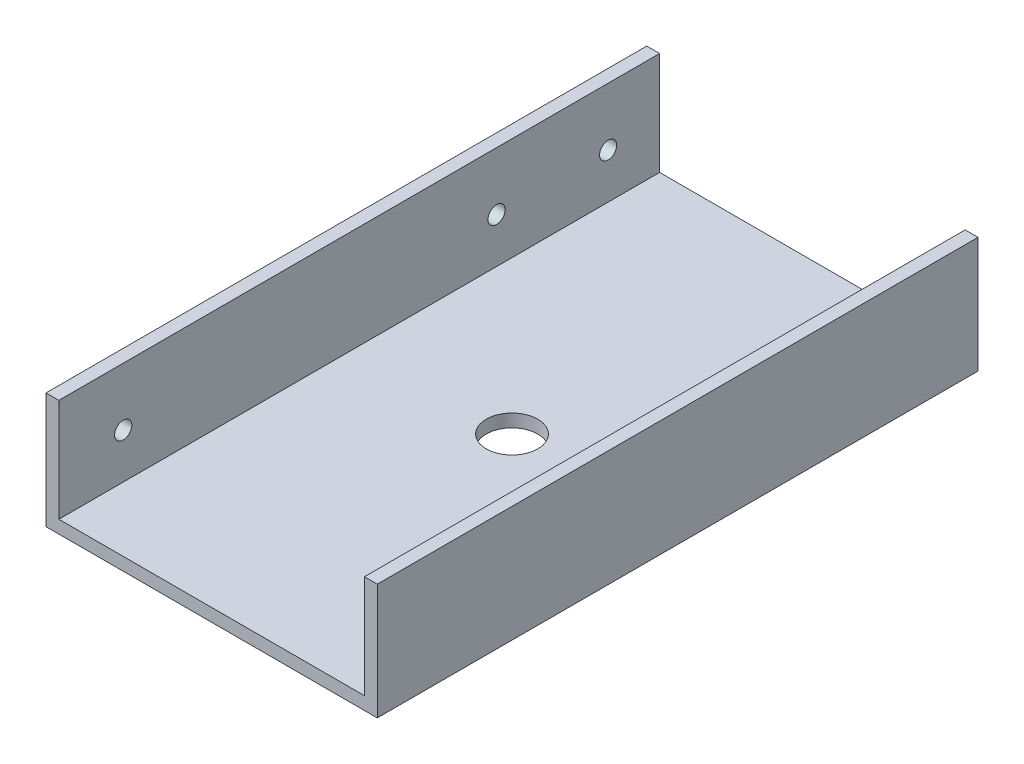
ISO-10303-21;
HEADER;
FILE_DESCRIPTION(('STEP AP214'),'2;1');
FILE_NAME('part.step','',(''),(''),'','','');
FILE_SCHEMA(('AUTOMOTIVE_DESIGN { 1 0 10303 214 1 1 1 1 }'));
ENDSEC;
DATA;
#1=APPLICATION_CONTEXT('core data for automotive mechanical design processes');
#2=APPLICATION_PROTOCOL_DEFINITION('international standard','automotive_design',2000,#1);
#3=PRODUCT_CONTEXT('',#1,'mechanical');
#4=PRODUCT('Part','Part','',(#3));
#5=PRODUCT_RELATED_PRODUCT_CATEGORY('part','',(#4));
#6=PRODUCT_DEFINITION_FORMATION('','',#4);
#7=PRODUCT_DEFINITION_CONTEXT('part definition',#1,'design');
#8=PRODUCT_DEFINITION('design','',#6,#7);
#9=PRODUCT_DEFINITION_SHAPE('','',#8);
#10=(LENGTH_UNIT() NAMED_UNIT(*) SI_UNIT(.MILLI.,.METRE.));
#11=(NAMED_UNIT(*) PLANE_ANGLE_UNIT() SI_UNIT($,.RADIAN.));
#12=(NAMED_UNIT(*) SI_UNIT($,.STERADIAN.) SOLID_ANGLE_UNIT());
#13=UNCERTAINTY_MEASURE_WITH_UNIT(LENGTH_MEASURE(1.E-05),#10,'distance_accuracy_value','');
#14=(GEOMETRIC_REPRESENTATION_CONTEXT(3) GLOBAL_UNCERTAINTY_ASSIGNED_CONTEXT((#13)) GLOBAL_UNIT_ASSIGNED_CONTEXT((#10,
#11,#12)) REPRESENTATION_CONTEXT('',''));
#15=CARTESIAN_POINT('',(0.,0.,0.));
#16=DIRECTION('',(0.,0.,1.));
#17=DIRECTION('',(1.,0.,0.));
#18=AXIS2_PLACEMENT_3D('',#15,#16,#17);
#19=CARTESIAN_POINT('',(-19.3,13.5,35.));
#20=DIRECTION('',(0.,-1.,0.));
#21=DIRECTION('',(0.,0.,-1.));
#22=AXIS2_PLACEMENT_3D('',#19,#20,#21);
#23=PLANE('',#22);
#24=DIRECTION('',(-1.,0.,0.));
#25=VECTOR('',#24,1.);
#26=CARTESIAN_POINT('',(-19.3,13.5,-35.));
#27=LINE('',#26,#25);
#28=CARTESIAN_POINT('',(-17.8,13.5,-35.));
#29=VERTEX_POINT('',#28);
#30=CARTESIAN_POINT('',(-19.3,13.5,-35.));
#31=VERTEX_POINT('',#30);
#32=EDGE_CURVE('E129',#29,#31,#27,.T.);
#33=ORIENTED_EDGE('',*,*,#32,.T.);
#34=DIRECTION('',(0.,0.,-1.));
#35=VECTOR('',#34,1.);
#36=CARTESIAN_POINT('',(-19.3,13.5,35.));
#37=LINE('',#36,#35);
#38=CARTESIAN_POINT('',(-19.3,13.5,35.));
#39=VERTEX_POINT('',#38);
#40=EDGE_CURVE('E11',#39,#31,#37,.T.);
#41=ORIENTED_EDGE('',*,*,#40,.F.);
#42=DIRECTION('',(-1.,0.,0.));
#43=VECTOR('',#42,1.);
#44=CARTESIAN_POINT('',(-19.3,13.5,35.));
#45=LINE('',#44,#43);
#46=CARTESIAN_POINT('',(-17.8,13.5,35.));
#47=VERTEX_POINT('',#46);
#48=EDGE_CURVE('E143',#47,#39,#45,.T.);
#49=ORIENTED_EDGE('',*,*,#48,.F.);
#50=DIRECTION('',(0.,0.,-1.));
#51=VECTOR('',#50,1.);
#52=CARTESIAN_POINT('',(-17.8,13.5,35.));
#53=LINE('',#52,#51);
#54=EDGE_CURVE('E125',#47,#29,#53,.T.);
#55=ORIENTED_EDGE('',*,*,#54,.T.);
#56=EDGE_LOOP('',(#33,#41,#49,#55));
#57=FACE_BOUND('',#56,.T.);
#58=ADVANCED_FACE('F32',(#57),#23,.F.);
#59=CARTESIAN_POINT('',(-19.3,13.5,35.));
#60=DIRECTION('',(1.,0.,0.));
#61=DIRECTION('',(0.,1.,0.));
#62=AXIS2_PLACEMENT_3D('',#59,#60,#61);
#63=PLANE('',#62);
#64=CARTESIAN_POINT('',(-19.3,6.75,27.5));
#65=DIRECTION('',(-1.,0.,0.));
#66=DIRECTION('',(0.,-1.,0.));
#67=AXIS2_PLACEMENT_3D('',#64,#65,#66);
#68=CIRCLE('',#67,1.);
#69=CARTESIAN_POINT('',(-19.3,5.75,27.5));
#70=VERTEX_POINT('',#69);
#71=EDGE_CURVE('E192',#70,#70,#68,.T.);
#72=ORIENTED_EDGE('',*,*,#71,.F.);
#73=EDGE_LOOP('',(#72));
#74=FACE_BOUND('',#73,.T.);
#75=CARTESIAN_POINT('',(-19.3,6.75,-16.));
#76=DIRECTION('',(-1.,0.,0.));
#77=DIRECTION('',(0.,-1.,0.));
#78=AXIS2_PLACEMENT_3D('',#75,#76,#77);
#79=CIRCLE('',#78,1.);
#80=CARTESIAN_POINT('',(-19.3,5.75,-16.));
#81=VERTEX_POINT('',#80);
#82=EDGE_CURVE('E186',#81,#81,#79,.T.);
#83=ORIENTED_EDGE('',*,*,#82,.F.);
#84=EDGE_LOOP('',(#83));
#85=FACE_BOUND('',#84,.T.);
#86=CARTESIAN_POINT('',(-19.3,6.75,-29.));
#87=DIRECTION('',(-1.,0.,0.));
#88=DIRECTION('',(0.,-1.,0.));
#89=AXIS2_PLACEMENT_3D('',#86,#87,#88);
#90=CIRCLE('',#89,1.);
#91=CARTESIAN_POINT('',(-19.3,5.75,-29.));
#92=VERTEX_POINT('',#91);
#93=EDGE_CURVE('E180',#92,#92,#90,.T.);
#94=ORIENTED_EDGE('',*,*,#93,.F.);
#95=EDGE_LOOP('',(#94));
#96=FACE_BOUND('',#95,.T.);
#97=DIRECTION('',(0.,-1.,0.));
#98=VECTOR('',#97,1.);
#99=CARTESIAN_POINT('',(-19.3,13.5,-35.));
#100=LINE('',#99,#98);
#101=CARTESIAN_POINT('',(-19.3,0.,-35.));
#102=VERTEX_POINT('',#101);
#103=EDGE_CURVE('E132',#31,#102,#100,.T.);
#104=ORIENTED_EDGE('',*,*,#103,.T.);
#105=DIRECTION('',(0.,0.,-1.));
#106=VECTOR('',#105,1.);
#107=CARTESIAN_POINT('',(-19.3,0.,35.));
#108=LINE('',#107,#106);
#109=CARTESIAN_POINT('',(-19.3,0.,35.));
#110=VERTEX_POINT('',#109);
#111=EDGE_CURVE('E41',#110,#102,#108,.T.);
#112=ORIENTED_EDGE('',*,*,#111,.F.);
#113=DIRECTION('',(0.,-1.,0.));
#114=VECTOR('',#113,1.);
#115=CARTESIAN_POINT('',(-19.3,13.5,35.));
#116=LINE('',#115,#114);
#117=EDGE_CURVE('E92',#39,#110,#116,.T.);
#118=ORIENTED_EDGE('',*,*,#117,.F.);
#119=ORIENTED_EDGE('',*,*,#40,.T.);
#120=EDGE_LOOP('',(#104,#112,#118,#119));
#121=FACE_BOUND('',#120,.T.);
#122=ADVANCED_FACE('F224',(#74,#85,#96,#121),#63,.F.);
#123=CARTESIAN_POINT('',(-19.3,0.,35.));
#124=DIRECTION('',(0.,1.,0.));
#125=DIRECTION('',(0.,0.,1.));
#126=AXIS2_PLACEMENT_3D('',#123,#124,#125);
#127=PLANE('',#126);
#128=CARTESIAN_POINT('',(0.,0.,0.));
#129=DIRECTION('',(0.,-1.,0.));
#130=DIRECTION('',(0.,0.,-1.));
#131=AXIS2_PLACEMENT_3D('',#128,#129,#130);
#132=CIRCLE('',#131,3.);
#133=CARTESIAN_POINT('',(0.,0.,-3.));
#134=VERTEX_POINT('',#133);
#135=EDGE_CURVE('E177',#134,#134,#132,.T.);
#136=ORIENTED_EDGE('',*,*,#135,.F.);
#137=EDGE_LOOP('',(#136));
#138=FACE_BOUND('',#137,.T.);
#139=DIRECTION('',(1.,0.,0.));
#140=VECTOR('',#139,1.);
#141=CARTESIAN_POINT('',(-19.3,0.,-35.));
#142=LINE('',#141,#140);
#143=CARTESIAN_POINT('',(19.3,0.,-35.));
#144=VERTEX_POINT('',#143);
#145=EDGE_CURVE('E134',#102,#144,#142,.T.);
#146=ORIENTED_EDGE('',*,*,#145,.T.);
#147=DIRECTION('',(0.,0.,-1.));
#148=VECTOR('',#147,1.);
#149=CARTESIAN_POINT('',(19.3,0.,35.));
#150=LINE('',#149,#148);
#151=CARTESIAN_POINT('',(19.3,0.,35.));
#152=VERTEX_POINT('',#151);
#153=EDGE_CURVE('E150',#152,#144,#150,.T.);
#154=ORIENTED_EDGE('',*,*,#153,.F.);
#155=DIRECTION('',(1.,0.,0.));
#156=VECTOR('',#155,1.);
#157=CARTESIAN_POINT('',(-19.3,0.,35.));
#158=LINE('',#157,#156);
#159=EDGE_CURVE('E159',#110,#152,#158,.T.);
#160=ORIENTED_EDGE('',*,*,#159,.F.);
#161=ORIENTED_EDGE('',*,*,#111,.T.);
#162=EDGE_LOOP('',(#146,#154,#160,#161));
#163=FACE_BOUND('',#162,.T.);
#164=ADVANCED_FACE('F157',(#138,#163),#127,.F.);
#165=CARTESIAN_POINT('',(19.3,0.,35.));
#166=DIRECTION('',(-1.,0.,0.));
#167=DIRECTION('',(0.,-1.,0.));
#168=AXIS2_PLACEMENT_3D('',#165,#166,#167);
#169=PLANE('',#168);
#170=DIRECTION('',(0.,1.,0.));
#171=VECTOR('',#170,1.);
#172=CARTESIAN_POINT('',(19.3,0.,-35.));
#173=LINE('',#172,#171);
#174=CARTESIAN_POINT('',(19.3,13.5,-35.));
#175=VERTEX_POINT('',#174);
#176=EDGE_CURVE('E136',#144,#175,#173,.T.);
#177=ORIENTED_EDGE('',*,*,#176,.T.);
#178=DIRECTION('',(0.,0.,-1.));
#179=VECTOR('',#178,1.);
#180=CARTESIAN_POINT('',(19.3,13.5,35.));
#181=LINE('',#180,#179);
#182=CARTESIAN_POINT('',(19.3,13.5,35.));
#183=VERTEX_POINT('',#182);
#184=EDGE_CURVE('E147',#183,#175,#181,.T.);
#185=ORIENTED_EDGE('',*,*,#184,.F.);
#186=DIRECTION('',(0.,1.,0.));
#187=VECTOR('',#186,1.);
#188=CARTESIAN_POINT('',(19.3,0.,35.));
#189=LINE('',#188,#187);
#190=EDGE_CURVE('E171',#152,#183,#189,.T.);
#191=ORIENTED_EDGE('',*,*,#190,.F.);
#192=ORIENTED_EDGE('',*,*,#153,.T.);
#193=EDGE_LOOP('',(#177,#185,#191,#192));
#194=FACE_BOUND('',#193,.T.);
#195=ADVANCED_FACE('F167',(#194),#169,.F.);
#196=CARTESIAN_POINT('',(17.8,13.5,35.));
#197=DIRECTION('',(0.,-1.,0.));
#198=DIRECTION('',(0.,0.,-1.));
#199=AXIS2_PLACEMENT_3D('',#196,#197,#198);
#200=PLANE('',#199);
#201=DIRECTION('',(-1.,0.,0.));
#202=VECTOR('',#201,1.);
#203=CARTESIAN_POINT('',(17.8,13.5,-35.));
#204=LINE('',#203,#202);
#205=CARTESIAN_POINT('',(17.8,13.5,-35.));
#206=VERTEX_POINT('',#205);
#207=EDGE_CURVE('E138',#175,#206,#204,.T.);
#208=ORIENTED_EDGE('',*,*,#207,.T.);
#209=DIRECTION('',(0.,0.,-1.));
#210=VECTOR('',#209,1.);
#211=CARTESIAN_POINT('',(17.8,13.5,35.));
#212=LINE('',#211,#210);
#213=CARTESIAN_POINT('',(17.8,13.5,35.));
#214=VERTEX_POINT('',#213);
#215=EDGE_CURVE('E120',#214,#206,#212,.T.);
#216=ORIENTED_EDGE('',*,*,#215,.F.);
#217=DIRECTION('',(-1.,0.,0.));
#218=VECTOR('',#217,1.);
#219=CARTESIAN_POINT('',(17.8,13.5,35.));
#220=LINE('',#219,#218);
#221=EDGE_CURVE('E111',#183,#214,#220,.T.);
#222=ORIENTED_EDGE('',*,*,#221,.F.);
#223=ORIENTED_EDGE('',*,*,#184,.T.);
#224=EDGE_LOOP('',(#208,#216,#222,#223));
#225=FACE_BOUND('',#224,.T.);
#226=ADVANCED_FACE('F170',(#225),#200,.F.);
#227=CARTESIAN_POINT('',(17.8,1.5,35.));
#228=DIRECTION('',(1.,0.,0.));
#229=DIRECTION('',(0.,0.,-1.));
#230=AXIS2_PLACEMENT_3D('',#227,#228,#229);
#231=PLANE('',#230);
#232=DIRECTION('',(0.,-1.,0.));
#233=VECTOR('',#232,1.);
#234=CARTESIAN_POINT('',(17.8,1.5,-35.));
#235=LINE('',#234,#233);
#236=CARTESIAN_POINT('',(17.8,1.5,-35.));
#237=VERTEX_POINT('',#236);
#238=EDGE_CURVE('E119',#206,#237,#235,.T.);
#239=ORIENTED_EDGE('',*,*,#238,.T.);
#240=DIRECTION('',(0.,0.,-1.));
#241=VECTOR('',#240,1.);
#242=CARTESIAN_POINT('',(17.8,1.5,35.));
#243=LINE('',#242,#241);
#244=CARTESIAN_POINT('',(17.8,1.5,35.));
#245=VERTEX_POINT('',#244);
#246=EDGE_CURVE('E116',#245,#237,#243,.T.);
#247=ORIENTED_EDGE('',*,*,#246,.F.);
#248=DIRECTION('',(0.,-1.,0.));
#249=VECTOR('',#248,1.);
#250=CARTESIAN_POINT('',(17.8,1.5,35.));
#251=LINE('',#250,#249);
#252=EDGE_CURVE('E105',#214,#245,#251,.T.);
#253=ORIENTED_EDGE('',*,*,#252,.F.);
#254=ORIENTED_EDGE('',*,*,#215,.T.);
#255=EDGE_LOOP('',(#239,#247,#253,#254));
#256=FACE_BOUND('',#255,.T.);
#257=ADVANCED_FACE('F117',(#256),#231,.F.);
#258=CARTESIAN_POINT('',(-17.8,1.5,35.));
#259=DIRECTION('',(0.,-1.,0.));
#260=DIRECTION('',(0.,0.,-1.));
#261=AXIS2_PLACEMENT_3D('',#258,#259,#260);
#262=PLANE('',#261);
#263=CARTESIAN_POINT('',(0.,1.5,0.));
#264=DIRECTION('',(0.,-1.,0.));
#265=DIRECTION('',(0.,0.,-1.));
#266=AXIS2_PLACEMENT_3D('',#263,#264,#265);
#267=CIRCLE('',#266,3.);
#268=CARTESIAN_POINT('',(0.,1.5,-3.));
#269=VERTEX_POINT('',#268);
#270=EDGE_CURVE('E35',#269,#269,#267,.T.);
#271=ORIENTED_EDGE('',*,*,#270,.T.);
#272=EDGE_LOOP('',(#271));
#273=FACE_BOUND('',#272,.T.);
#274=DIRECTION('',(-1.,0.,0.));
#275=VECTOR('',#274,1.);
#276=CARTESIAN_POINT('',(-17.8,1.5,-35.));
#277=LINE('',#276,#275);
#278=CARTESIAN_POINT('',(-17.8,1.5,-35.));
#279=VERTEX_POINT('',#278);
#280=EDGE_CURVE('E78',#237,#279,#277,.T.);
#281=ORIENTED_EDGE('',*,*,#280,.T.);
#282=DIRECTION('',(0.,0.,-1.));
#283=VECTOR('',#282,1.);
#284=CARTESIAN_POINT('',(-17.8,1.5,35.));
#285=LINE('',#284,#283);
#286=CARTESIAN_POINT('',(-17.8,1.5,35.));
#287=VERTEX_POINT('',#286);
#288=EDGE_CURVE('E121',#287,#279,#285,.T.);
#289=ORIENTED_EDGE('',*,*,#288,.F.);
#290=DIRECTION('',(-1.,0.,0.));
#291=VECTOR('',#290,1.);
#292=CARTESIAN_POINT('',(-17.8,1.5,35.));
#293=LINE('',#292,#291);
#294=EDGE_CURVE('E109',#245,#287,#293,.T.);
#295=ORIENTED_EDGE('',*,*,#294,.F.);
#296=ORIENTED_EDGE('',*,*,#246,.T.);
#297=EDGE_LOOP('',(#281,#289,#295,#296));
#298=FACE_BOUND('',#297,.T.);
#299=ADVANCED_FACE('F123',(#273,#298),#262,.F.);
#300=CARTESIAN_POINT('',(-17.8,13.5,35.));
#301=DIRECTION('',(-1.,0.,0.));
#302=DIRECTION('',(0.,0.,1.));
#303=AXIS2_PLACEMENT_3D('',#300,#301,#302);
#304=PLANE('',#303);
#305=CARTESIAN_POINT('',(-17.8,6.75,27.5));
#306=DIRECTION('',(-1.,0.,0.));
#307=DIRECTION('',(0.,0.,1.));
#308=AXIS2_PLACEMENT_3D('',#305,#306,#307);
#309=CIRCLE('',#308,1.);
#310=CARTESIAN_POINT('',(-17.8,6.75,28.5));
#311=VERTEX_POINT('',#310);
#312=EDGE_CURVE('E195',#311,#311,#309,.F.);
#313=ORIENTED_EDGE('',*,*,#312,.F.);
#314=EDGE_LOOP('',(#313));
#315=FACE_BOUND('',#314,.T.);
#316=CARTESIAN_POINT('',(-17.8,6.75,-16.));
#317=DIRECTION('',(-1.,0.,0.));
#318=DIRECTION('',(0.,0.,1.));
#319=AXIS2_PLACEMENT_3D('',#316,#317,#318);
#320=CIRCLE('',#319,1.);
#321=CARTESIAN_POINT('',(-17.8,6.75,-15.));
#322=VERTEX_POINT('',#321);
#323=EDGE_CURVE('E189',#322,#322,#320,.F.);
#324=ORIENTED_EDGE('',*,*,#323,.F.);
#325=EDGE_LOOP('',(#324));
#326=FACE_BOUND('',#325,.T.);
#327=CARTESIAN_POINT('',(-17.8,6.75,-29.));
#328=DIRECTION('',(-1.,0.,0.));
#329=DIRECTION('',(0.,0.,1.));
#330=AXIS2_PLACEMENT_3D('',#327,#328,#329);
#331=CIRCLE('',#330,1.);
#332=CARTESIAN_POINT('',(-17.8,6.75,-28.));
#333=VERTEX_POINT('',#332);
#334=EDGE_CURVE('E183',#333,#333,#331,.F.);
#335=ORIENTED_EDGE('',*,*,#334,.F.);
#336=EDGE_LOOP('',(#335));
#337=FACE_BOUND('',#336,.T.);
#338=DIRECTION('',(0.,1.,0.));
#339=VECTOR('',#338,1.);
#340=CARTESIAN_POINT('',(-17.8,13.5,-35.));
#341=LINE('',#340,#339);
#342=EDGE_CURVE('E84',#279,#29,#341,.T.);
#343=ORIENTED_EDGE('',*,*,#342,.T.);
#344=ORIENTED_EDGE('',*,*,#54,.F.);
#345=DIRECTION('',(0.,1.,0.));
#346=VECTOR('',#345,1.);
#347=CARTESIAN_POINT('',(-17.8,13.5,35.));
#348=LINE('',#347,#346);
#349=EDGE_CURVE('E49',#287,#47,#348,.T.);
#350=ORIENTED_EDGE('',*,*,#349,.F.);
#351=ORIENTED_EDGE('',*,*,#288,.T.);
#352=EDGE_LOOP('',(#343,#344,#350,#351));
#353=FACE_BOUND('',#352,.T.);
#354=ADVANCED_FACE('F201',(#315,#326,#337,#353),#304,.F.);
#355=CARTESIAN_POINT('',(0.,0.,35.));
#356=DIRECTION('',(0.,0.,-1.));
#357=DIRECTION('',(-1.,0.,0.));
#358=AXIS2_PLACEMENT_3D('',#355,#356,#357);
#359=PLANE('',#358);
#360=ORIENTED_EDGE('',*,*,#48,.T.);
#361=ORIENTED_EDGE('',*,*,#117,.T.);
#362=ORIENTED_EDGE('',*,*,#159,.T.);
#363=ORIENTED_EDGE('',*,*,#190,.T.);
#364=ORIENTED_EDGE('',*,*,#221,.T.);
#365=ORIENTED_EDGE('',*,*,#252,.T.);
#366=ORIENTED_EDGE('',*,*,#294,.T.);
#367=ORIENTED_EDGE('',*,*,#349,.T.);
#368=EDGE_LOOP('',(#360,#361,#362,#363,#364,#365,#366,#367));
#369=FACE_BOUND('',#368,.T.);
#370=ADVANCED_FACE('F107',(#369),#359,.F.);
#371=CARTESIAN_POINT('',(0.,0.,-35.));
#372=DIRECTION('',(0.,0.,-1.));
#373=DIRECTION('',(-1.,0.,0.));
#374=AXIS2_PLACEMENT_3D('',#371,#372,#373);
#375=PLANE('',#374);
#376=ORIENTED_EDGE('',*,*,#32,.F.);
#377=ORIENTED_EDGE('',*,*,#342,.F.);
#378=ORIENTED_EDGE('',*,*,#280,.F.);
#379=ORIENTED_EDGE('',*,*,#238,.F.);
#380=ORIENTED_EDGE('',*,*,#207,.F.);
#381=ORIENTED_EDGE('',*,*,#176,.F.);
#382=ORIENTED_EDGE('',*,*,#145,.F.);
#383=ORIENTED_EDGE('',*,*,#103,.F.);
#384=EDGE_LOOP('',(#376,#377,#378,#379,#380,#381,#382,#383));
#385=FACE_BOUND('',#384,.T.);
#386=ADVANCED_FACE('F163',(#385),#375,.T.);
#387=CARTESIAN_POINT('',(0.,13.5,0.));
#388=DIRECTION('',(0.,-1.,0.));
#389=DIRECTION('',(0.,0.,-1.));
#390=AXIS2_PLACEMENT_3D('',#387,#388,#389);
#391=CYLINDRICAL_SURFACE('',#390,3.);
#392=ORIENTED_EDGE('',*,*,#135,.T.);
#393=EDGE_LOOP('',(#392));
#394=FACE_BOUND('',#393,.T.);
#395=ORIENTED_EDGE('',*,*,#270,.F.);
#396=EDGE_LOOP('',(#395));
#397=FACE_BOUND('',#396,.T.);
#398=ADVANCED_FACE('F212',(#394,#397),#391,.F.);
#399=CARTESIAN_POINT('',(19.301,6.75000000000002,-29.));
#400=DIRECTION('',(-1.,0.,0.));
#401=DIRECTION('',(0.,-1.,0.));
#402=AXIS2_PLACEMENT_3D('',#399,#400,#401);
#403=CYLINDRICAL_SURFACE('',#402,1.);
#404=ORIENTED_EDGE('',*,*,#93,.T.);
#405=EDGE_LOOP('',(#404));
#406=FACE_BOUND('',#405,.T.);
#407=ORIENTED_EDGE('',*,*,#334,.T.);
#408=EDGE_LOOP('',(#407));
#409=FACE_BOUND('',#408,.T.);
#410=ADVANCED_FACE('F209',(#406,#409),#403,.F.);
#411=CARTESIAN_POINT('',(19.301,6.75000000000002,-16.));
#412=DIRECTION('',(-1.,0.,0.));
#413=DIRECTION('',(0.,-1.,0.));
#414=AXIS2_PLACEMENT_3D('',#411,#412,#413);
#415=CYLINDRICAL_SURFACE('',#414,1.);
#416=ORIENTED_EDGE('',*,*,#82,.T.);
#417=EDGE_LOOP('',(#416));
#418=FACE_BOUND('',#417,.T.);
#419=ORIENTED_EDGE('',*,*,#323,.T.);
#420=EDGE_LOOP('',(#419));
#421=FACE_BOUND('',#420,.T.);
#422=ADVANCED_FACE('F211',(#418,#421),#415,.F.);
#423=CARTESIAN_POINT('',(19.301,6.75000000000002,27.5));
#424=DIRECTION('',(-1.,0.,0.));
#425=DIRECTION('',(0.,-1.,0.));
#426=AXIS2_PLACEMENT_3D('',#423,#424,#425);
#427=CYLINDRICAL_SURFACE('',#426,1.);
#428=ORIENTED_EDGE('',*,*,#71,.T.);
#429=EDGE_LOOP('',(#428));
#430=FACE_BOUND('',#429,.T.);
#431=ORIENTED_EDGE('',*,*,#312,.T.);
#432=EDGE_LOOP('',(#431));
#433=FACE_BOUND('',#432,.T.);
#434=ADVANCED_FACE('F199',(#430,#433),#427,.F.);
#435=CLOSED_SHELL('',(#58,#122,#164,#195,#226,#257,#299,#354,#370,#386,#398,#410,#422,#434));
#436=MANIFOLD_SOLID_BREP('B2',#435);
#437=ADVANCED_BREP_SHAPE_REPRESENTATION('',(#18,#436),#14);
#438=SHAPE_DEFINITION_REPRESENTATION(#9,#437);
ENDSEC;
END-ISO-10303-21;
